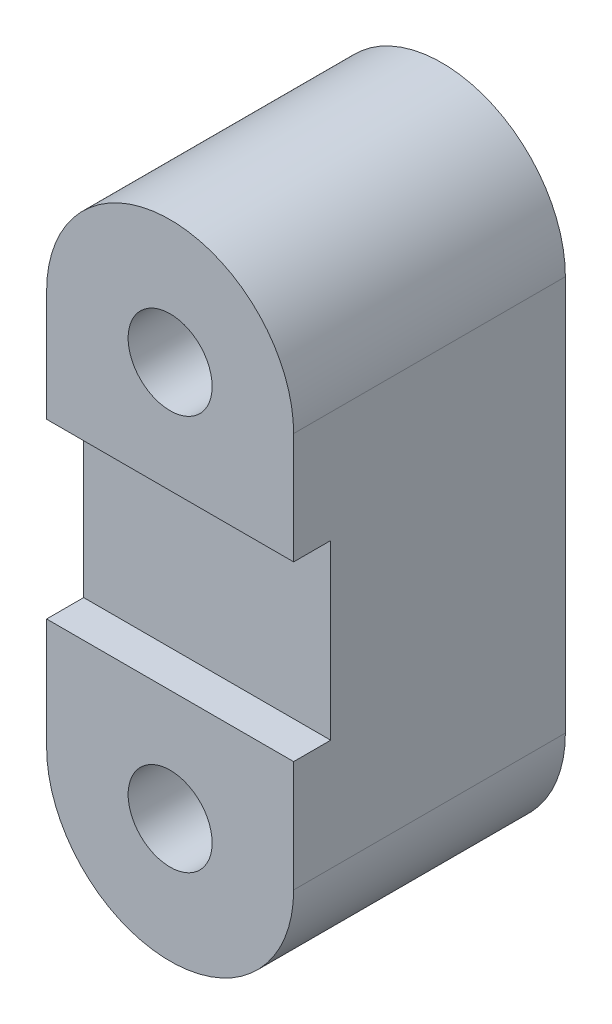
ISO-10303-21;
HEADER;
FILE_DESCRIPTION(('STEP AP214'),'2;1');
FILE_NAME('part.step','',(''),(''),'','','');
FILE_SCHEMA(('AUTOMOTIVE_DESIGN { 1 0 10303 214 1 1 1 1 }'));
ENDSEC;
DATA;
#1=APPLICATION_CONTEXT('core data for automotive mechanical design processes');
#2=APPLICATION_PROTOCOL_DEFINITION('international standard','automotive_design',2000,#1);
#3=PRODUCT_CONTEXT('',#1,'mechanical');
#4=PRODUCT('Part','Part','',(#3));
#5=PRODUCT_RELATED_PRODUCT_CATEGORY('part','',(#4));
#6=PRODUCT_DEFINITION_FORMATION('','',#4);
#7=PRODUCT_DEFINITION_CONTEXT('part definition',#1,'design');
#8=PRODUCT_DEFINITION('design','',#6,#7);
#9=PRODUCT_DEFINITION_SHAPE('','',#8);
#10=(LENGTH_UNIT() NAMED_UNIT(*) SI_UNIT(.MILLI.,.METRE.));
#11=(NAMED_UNIT(*) PLANE_ANGLE_UNIT() SI_UNIT($,.RADIAN.));
#12=(NAMED_UNIT(*) SI_UNIT($,.STERADIAN.) SOLID_ANGLE_UNIT());
#13=UNCERTAINTY_MEASURE_WITH_UNIT(LENGTH_MEASURE(1.E-05),#10,'distance_accuracy_value','');
#14=(GEOMETRIC_REPRESENTATION_CONTEXT(3) GLOBAL_UNCERTAINTY_ASSIGNED_CONTEXT((#13)) GLOBAL_UNIT_ASSIGNED_CONTEXT((#10,
#11,#12)) REPRESENTATION_CONTEXT('',''));
#15=CARTESIAN_POINT('',(0.,0.,0.));
#16=DIRECTION('',(0.,0.,1.));
#17=DIRECTION('',(1.,0.,0.));
#18=AXIS2_PLACEMENT_3D('',#15,#16,#17);
#19=CARTESIAN_POINT('',(0.,-8.,11.));
#20=DIRECTION('',(0.,0.,1.));
#21=DIRECTION('',(1.,0.,0.));
#22=AXIS2_PLACEMENT_3D('',#19,#20,#21);
#23=PLANE('',#22);
#24=DIRECTION('',(-1.,0.,0.));
#25=VECTOR('',#24,1.);
#26=CARTESIAN_POINT('',(-5.,3.5,11.));
#27=LINE('',#26,#25);
#28=CARTESIAN_POINT('',(5.,3.5,11.));
#29=VERTEX_POINT('',#28);
#30=CARTESIAN_POINT('',(-5.,3.5,11.));
#31=VERTEX_POINT('',#30);
#32=EDGE_CURVE('E121',#29,#31,#27,.T.);
#33=ORIENTED_EDGE('',*,*,#32,.F.);
#34=DIRECTION('',(0.,1.,0.));
#35=VECTOR('',#34,1.);
#36=CARTESIAN_POINT('',(5.,-8.,11.));
#37=LINE('',#36,#35);
#38=CARTESIAN_POINT('',(5.,8.,11.));
#39=VERTEX_POINT('',#38);
#40=EDGE_CURVE('E146',#29,#39,#37,.T.);
#41=ORIENTED_EDGE('',*,*,#40,.T.);
#42=CARTESIAN_POINT('',(0.,8.,11.));
#43=DIRECTION('',(0.,0.,1.));
#44=DIRECTION('',(1.,0.,0.));
#45=AXIS2_PLACEMENT_3D('',#42,#43,#44);
#46=CIRCLE('',#45,5.);
#47=CARTESIAN_POINT('',(-5.,8.,11.));
#48=VERTEX_POINT('',#47);
#49=EDGE_CURVE('E148',#39,#48,#46,.T.);
#50=ORIENTED_EDGE('',*,*,#49,.T.);
#51=DIRECTION('',(0.,-1.,0.));
#52=VECTOR('',#51,1.);
#53=CARTESIAN_POINT('',(-5.,-8.,11.));
#54=LINE('',#53,#52);
#55=EDGE_CURVE('E150',#48,#31,#54,.T.);
#56=ORIENTED_EDGE('',*,*,#55,.T.);
#57=EDGE_LOOP('',(#33,#41,#50,#56));
#58=FACE_BOUND('',#57,.T.);
#59=CARTESIAN_POINT('',(0.,8.,11.));
#60=DIRECTION('',(0.,0.,1.));
#61=DIRECTION('',(1.,0.,0.));
#62=AXIS2_PLACEMENT_3D('',#59,#60,#61);
#63=CIRCLE('',#62,1.7);
#64=CARTESIAN_POINT('',(1.7,8.,11.));
#65=VERTEX_POINT('',#64);
#66=EDGE_CURVE('E138',#65,#65,#63,.T.);
#67=ORIENTED_EDGE('',*,*,#66,.F.);
#68=EDGE_LOOP('',(#67));
#69=FACE_BOUND('',#68,.T.);
#70=ADVANCED_FACE('F33',(#58,#69),#23,.T.);
#71=DIRECTION('',(1.,0.,0.));
#72=VECTOR('',#71,1.);
#73=CARTESIAN_POINT('',(-5.,-3.5,11.));
#74=LINE('',#73,#72);
#75=CARTESIAN_POINT('',(-5.,-3.5,11.));
#76=VERTEX_POINT('',#75);
#77=CARTESIAN_POINT('',(5.,-3.5,11.));
#78=VERTEX_POINT('',#77);
#79=EDGE_CURVE('E180',#76,#78,#74,.T.);
#80=ORIENTED_EDGE('',*,*,#79,.F.);
#81=CARTESIAN_POINT('',(-5.,-8.,11.));
#82=VERTEX_POINT('',#81);
#83=EDGE_CURVE('E57',#76,#82,#54,.T.);
#84=ORIENTED_EDGE('',*,*,#83,.T.);
#85=CARTESIAN_POINT('',(0.,-8.,11.));
#86=DIRECTION('',(0.,0.,1.));
#87=DIRECTION('',(1.,0.,0.));
#88=AXIS2_PLACEMENT_3D('',#85,#86,#87);
#89=CIRCLE('',#88,5.);
#90=CARTESIAN_POINT('',(5.,-8.,11.));
#91=VERTEX_POINT('',#90);
#92=EDGE_CURVE('E144',#82,#91,#89,.T.);
#93=ORIENTED_EDGE('',*,*,#92,.T.);
#94=EDGE_CURVE('E86',#91,#78,#37,.T.);
#95=ORIENTED_EDGE('',*,*,#94,.T.);
#96=EDGE_LOOP('',(#80,#84,#93,#95));
#97=FACE_BOUND('',#96,.T.);
#98=CARTESIAN_POINT('',(0.,-8.,11.));
#99=DIRECTION('',(0.,0.,1.));
#100=DIRECTION('',(1.,0.,0.));
#101=AXIS2_PLACEMENT_3D('',#98,#99,#100);
#102=CIRCLE('',#101,1.7);
#103=CARTESIAN_POINT('',(1.7,-8.,11.));
#104=VERTEX_POINT('',#103);
#105=EDGE_CURVE('E130',#104,#104,#102,.T.);
#106=ORIENTED_EDGE('',*,*,#105,.F.);
#107=EDGE_LOOP('',(#106));
#108=FACE_BOUND('',#107,.T.);
#109=ADVANCED_FACE('F178',(#97,#108),#23,.T.);
#110=CARTESIAN_POINT('',(0.,-8.,0.));
#111=DIRECTION('',(0.,0.,1.));
#112=DIRECTION('',(1.,0.,0.));
#113=AXIS2_PLACEMENT_3D('',#110,#111,#112);
#114=PLANE('',#113);
#115=CARTESIAN_POINT('',(0.,8.,0.));
#116=DIRECTION('',(0.,0.,1.));
#117=DIRECTION('',(1.,0.,0.));
#118=AXIS2_PLACEMENT_3D('',#115,#116,#117);
#119=CIRCLE('',#118,1.7);
#120=CARTESIAN_POINT('',(1.7,8.,0.));
#121=VERTEX_POINT('',#120);
#122=EDGE_CURVE('E133',#121,#121,#119,.T.);
#123=ORIENTED_EDGE('',*,*,#122,.T.);
#124=EDGE_LOOP('',(#123));
#125=FACE_BOUND('',#124,.T.);
#126=CARTESIAN_POINT('',(0.,-8.,0.));
#127=DIRECTION('',(0.,0.,1.));
#128=DIRECTION('',(1.,0.,0.));
#129=AXIS2_PLACEMENT_3D('',#126,#127,#128);
#130=CIRCLE('',#129,5.);
#131=CARTESIAN_POINT('',(-5.,-8.,0.));
#132=VERTEX_POINT('',#131);
#133=CARTESIAN_POINT('',(5.,-8.,0.));
#134=VERTEX_POINT('',#133);
#135=EDGE_CURVE('E141',#132,#134,#130,.T.);
#136=ORIENTED_EDGE('',*,*,#135,.F.);
#137=DIRECTION('',(0.,-1.,0.));
#138=VECTOR('',#137,1.);
#139=CARTESIAN_POINT('',(-5.,-8.,0.));
#140=LINE('',#139,#138);
#141=CARTESIAN_POINT('',(-5.,8.,0.));
#142=VERTEX_POINT('',#141);
#143=EDGE_CURVE('E79',#142,#132,#140,.T.);
#144=ORIENTED_EDGE('',*,*,#143,.F.);
#145=CARTESIAN_POINT('',(0.,8.,0.));
#146=DIRECTION('',(0.,0.,1.));
#147=DIRECTION('',(1.,0.,0.));
#148=AXIS2_PLACEMENT_3D('',#145,#146,#147);
#149=CIRCLE('',#148,5.);
#150=CARTESIAN_POINT('',(5.,8.,0.));
#151=VERTEX_POINT('',#150);
#152=EDGE_CURVE('E158',#151,#142,#149,.T.);
#153=ORIENTED_EDGE('',*,*,#152,.F.);
#154=DIRECTION('',(0.,1.,0.));
#155=VECTOR('',#154,1.);
#156=CARTESIAN_POINT('',(5.,-8.,0.));
#157=LINE('',#156,#155);
#158=EDGE_CURVE('E156',#134,#151,#157,.T.);
#159=ORIENTED_EDGE('',*,*,#158,.F.);
#160=EDGE_LOOP('',(#136,#144,#153,#159));
#161=FACE_BOUND('',#160,.T.);
#162=CARTESIAN_POINT('',(0.,-8.,0.));
#163=DIRECTION('',(0.,0.,1.));
#164=DIRECTION('',(1.,0.,0.));
#165=AXIS2_PLACEMENT_3D('',#162,#163,#164);
#166=CIRCLE('',#165,1.7);
#167=CARTESIAN_POINT('',(1.7,-8.,0.));
#168=VERTEX_POINT('',#167);
#169=EDGE_CURVE('E134',#168,#168,#166,.T.);
#170=ORIENTED_EDGE('',*,*,#169,.T.);
#171=EDGE_LOOP('',(#170));
#172=FACE_BOUND('',#171,.T.);
#173=ADVANCED_FACE('F173',(#125,#161,#172),#114,.F.);
#174=CARTESIAN_POINT('',(0.,-8.,11.));
#175=DIRECTION('',(0.,0.,-1.));
#176=DIRECTION('',(-1.,0.,0.));
#177=AXIS2_PLACEMENT_3D('',#174,#175,#176);
#178=CYLINDRICAL_SURFACE('',#177,5.);
#179=ORIENTED_EDGE('',*,*,#135,.T.);
#180=DIRECTION('',(0.,0.,-1.));
#181=VECTOR('',#180,1.);
#182=CARTESIAN_POINT('',(5.,-8.,11.));
#183=LINE('',#182,#181);
#184=EDGE_CURVE('E11',#91,#134,#183,.T.);
#185=ORIENTED_EDGE('',*,*,#184,.F.);
#186=ORIENTED_EDGE('',*,*,#92,.F.);
#187=DIRECTION('',(0.,0.,-1.));
#188=VECTOR('',#187,1.);
#189=CARTESIAN_POINT('',(-5.,-8.,11.));
#190=LINE('',#189,#188);
#191=EDGE_CURVE('E153',#82,#132,#190,.T.);
#192=ORIENTED_EDGE('',*,*,#191,.T.);
#193=EDGE_LOOP('',(#179,#185,#186,#192));
#194=FACE_BOUND('',#193,.T.);
#195=ADVANCED_FACE('F35',(#194),#178,.T.);
#196=CARTESIAN_POINT('',(5.,-8.,11.));
#197=DIRECTION('',(-1.,0.,0.));
#198=DIRECTION('',(0.,0.,1.));
#199=AXIS2_PLACEMENT_3D('',#196,#197,#198);
#200=PLANE('',#199);
#201=ORIENTED_EDGE('',*,*,#40,.F.);
#202=DIRECTION('',(0.,0.,1.));
#203=VECTOR('',#202,1.);
#204=CARTESIAN_POINT('',(5.,3.5,9.5));
#205=LINE('',#204,#203);
#206=CARTESIAN_POINT('',(5.,3.5,9.5));
#207=VERTEX_POINT('',#206);
#208=EDGE_CURVE('E125',#207,#29,#205,.T.);
#209=ORIENTED_EDGE('',*,*,#208,.F.);
#210=DIRECTION('',(0.,1.,0.));
#211=VECTOR('',#210,1.);
#212=CARTESIAN_POINT('',(5.,-3.5,9.5));
#213=LINE('',#212,#211);
#214=CARTESIAN_POINT('',(5.,-3.5,9.5));
#215=VERTEX_POINT('',#214);
#216=EDGE_CURVE('E115',#215,#207,#213,.T.);
#217=ORIENTED_EDGE('',*,*,#216,.F.);
#218=DIRECTION('',(0.,0.,1.));
#219=VECTOR('',#218,1.);
#220=CARTESIAN_POINT('',(5.,-3.5,9.5));
#221=LINE('',#220,#219);
#222=EDGE_CURVE('E113',#215,#78,#221,.T.);
#223=ORIENTED_EDGE('',*,*,#222,.T.);
#224=ORIENTED_EDGE('',*,*,#94,.F.);
#225=ORIENTED_EDGE('',*,*,#184,.T.);
#226=ORIENTED_EDGE('',*,*,#158,.T.);
#227=DIRECTION('',(0.,0.,-1.));
#228=VECTOR('',#227,1.);
#229=CARTESIAN_POINT('',(5.,8.,11.));
#230=LINE('',#229,#228);
#231=EDGE_CURVE('E41',#39,#151,#230,.T.);
#232=ORIENTED_EDGE('',*,*,#231,.F.);
#233=EDGE_LOOP('',(#201,#209,#217,#223,#224,#225,#226,#232));
#234=FACE_BOUND('',#233,.T.);
#235=ADVANCED_FACE('F192',(#234),#200,.F.);
#236=CARTESIAN_POINT('',(0.,8.,11.));
#237=DIRECTION('',(0.,0.,-1.));
#238=DIRECTION('',(-1.,0.,0.));
#239=AXIS2_PLACEMENT_3D('',#236,#237,#238);
#240=CYLINDRICAL_SURFACE('',#239,5.);
#241=ORIENTED_EDGE('',*,*,#152,.T.);
#242=DIRECTION('',(0.,0.,-1.));
#243=VECTOR('',#242,1.);
#244=CARTESIAN_POINT('',(-5.,8.,11.));
#245=LINE('',#244,#243);
#246=EDGE_CURVE('E162',#48,#142,#245,.T.);
#247=ORIENTED_EDGE('',*,*,#246,.F.);
#248=ORIENTED_EDGE('',*,*,#49,.F.);
#249=ORIENTED_EDGE('',*,*,#231,.T.);
#250=EDGE_LOOP('',(#241,#247,#248,#249));
#251=FACE_BOUND('',#250,.T.);
#252=ADVANCED_FACE('F168',(#251),#240,.T.);
#253=CARTESIAN_POINT('',(-5.,-8.,11.));
#254=DIRECTION('',(1.,0.,0.));
#255=DIRECTION('',(0.,0.,-1.));
#256=AXIS2_PLACEMENT_3D('',#253,#254,#255);
#257=PLANE('',#256);
#258=DIRECTION('',(0.,-1.,0.));
#259=VECTOR('',#258,1.);
#260=CARTESIAN_POINT('',(-5.,-3.5,9.5));
#261=LINE('',#260,#259);
#262=CARTESIAN_POINT('',(-5.,3.5,9.5));
#263=VERTEX_POINT('',#262);
#264=CARTESIAN_POINT('',(-5.,-3.5,9.5));
#265=VERTEX_POINT('',#264);
#266=EDGE_CURVE('E116',#263,#265,#261,.T.);
#267=ORIENTED_EDGE('',*,*,#266,.F.);
#268=DIRECTION('',(0.,0.,1.));
#269=VECTOR('',#268,1.);
#270=CARTESIAN_POINT('',(-5.,3.5,9.5));
#271=LINE('',#270,#269);
#272=EDGE_CURVE('E137',#263,#31,#271,.T.);
#273=ORIENTED_EDGE('',*,*,#272,.T.);
#274=ORIENTED_EDGE('',*,*,#55,.F.);
#275=ORIENTED_EDGE('',*,*,#246,.T.);
#276=ORIENTED_EDGE('',*,*,#143,.T.);
#277=ORIENTED_EDGE('',*,*,#191,.F.);
#278=ORIENTED_EDGE('',*,*,#83,.F.);
#279=DIRECTION('',(0.,0.,1.));
#280=VECTOR('',#279,1.);
#281=CARTESIAN_POINT('',(-5.,-3.5,9.5));
#282=LINE('',#281,#280);
#283=EDGE_CURVE('E112',#265,#76,#282,.T.);
#284=ORIENTED_EDGE('',*,*,#283,.F.);
#285=EDGE_LOOP('',(#267,#273,#274,#275,#276,#277,#278,#284));
#286=FACE_BOUND('',#285,.T.);
#287=ADVANCED_FACE('F123',(#286),#257,.F.);
#288=CARTESIAN_POINT('',(0.,8.,11.));
#289=DIRECTION('',(0.,0.,-1.));
#290=DIRECTION('',(-1.,0.,0.));
#291=AXIS2_PLACEMENT_3D('',#288,#289,#290);
#292=CYLINDRICAL_SURFACE('',#291,1.7);
#293=ORIENTED_EDGE('',*,*,#66,.T.);
#294=EDGE_LOOP('',(#293));
#295=FACE_BOUND('',#294,.T.);
#296=ORIENTED_EDGE('',*,*,#122,.F.);
#297=EDGE_LOOP('',(#296));
#298=FACE_BOUND('',#297,.T.);
#299=ADVANCED_FACE('F208',(#295,#298),#292,.F.);
#300=CARTESIAN_POINT('',(0.,-8.,11.));
#301=DIRECTION('',(0.,0.,-1.));
#302=DIRECTION('',(-1.,0.,0.));
#303=AXIS2_PLACEMENT_3D('',#300,#301,#302);
#304=CYLINDRICAL_SURFACE('',#303,1.7);
#305=ORIENTED_EDGE('',*,*,#105,.T.);
#306=EDGE_LOOP('',(#305));
#307=FACE_BOUND('',#306,.T.);
#308=ORIENTED_EDGE('',*,*,#169,.F.);
#309=EDGE_LOOP('',(#308));
#310=FACE_BOUND('',#309,.T.);
#311=ADVANCED_FACE('F217',(#307,#310),#304,.F.);
#312=CARTESIAN_POINT('',(-5.,3.5,9.5));
#313=DIRECTION('',(0.,1.,0.));
#314=DIRECTION('',(-1.,0.,0.));
#315=AXIS2_PLACEMENT_3D('',#312,#313,#314);
#316=PLANE('',#315);
#317=ORIENTED_EDGE('',*,*,#32,.T.);
#318=ORIENTED_EDGE('',*,*,#272,.F.);
#319=DIRECTION('',(-1.,0.,0.));
#320=VECTOR('',#319,1.);
#321=CARTESIAN_POINT('',(-5.,3.5,9.5));
#322=LINE('',#321,#320);
#323=EDGE_CURVE('E48',#207,#263,#322,.T.);
#324=ORIENTED_EDGE('',*,*,#323,.F.);
#325=ORIENTED_EDGE('',*,*,#208,.T.);
#326=EDGE_LOOP('',(#317,#318,#324,#325));
#327=FACE_BOUND('',#326,.T.);
#328=ADVANCED_FACE('F188',(#327),#316,.F.);
#329=CARTESIAN_POINT('',(-5.,-3.5,9.5));
#330=DIRECTION('',(0.,-1.,0.));
#331=DIRECTION('',(0.,0.,-1.));
#332=AXIS2_PLACEMENT_3D('',#329,#330,#331);
#333=PLANE('',#332);
#334=ORIENTED_EDGE('',*,*,#79,.T.);
#335=ORIENTED_EDGE('',*,*,#222,.F.);
#336=DIRECTION('',(1.,0.,0.));
#337=VECTOR('',#336,1.);
#338=CARTESIAN_POINT('',(-5.,-3.5,9.5));
#339=LINE('',#338,#337);
#340=EDGE_CURVE('E109',#265,#215,#339,.T.);
#341=ORIENTED_EDGE('',*,*,#340,.F.);
#342=ORIENTED_EDGE('',*,*,#283,.T.);
#343=EDGE_LOOP('',(#334,#335,#341,#342));
#344=FACE_BOUND('',#343,.T.);
#345=ADVANCED_FACE('F110',(#344),#333,.F.);
#346=CARTESIAN_POINT('',(0.,0.,9.5));
#347=DIRECTION('',(0.,0.,-1.));
#348=DIRECTION('',(-1.,0.,0.));
#349=AXIS2_PLACEMENT_3D('',#346,#347,#348);
#350=PLANE('',#349);
#351=ORIENTED_EDGE('',*,*,#266,.T.);
#352=ORIENTED_EDGE('',*,*,#340,.T.);
#353=ORIENTED_EDGE('',*,*,#216,.T.);
#354=ORIENTED_EDGE('',*,*,#323,.T.);
#355=EDGE_LOOP('',(#351,#352,#353,#354));
#356=FACE_BOUND('',#355,.T.);
#357=ADVANCED_FACE('F119',(#356),#350,.F.);
#358=CLOSED_SHELL('',(#70,#109,#173,#195,#235,#252,#287,#299,#311,#328,#345,#357));
#359=MANIFOLD_SOLID_BREP('B2',#358);
#360=ADVANCED_BREP_SHAPE_REPRESENTATION('',(#18,#359),#14);
#361=SHAPE_DEFINITION_REPRESENTATION(#9,#360);
ENDSEC;
END-ISO-10303-21;
